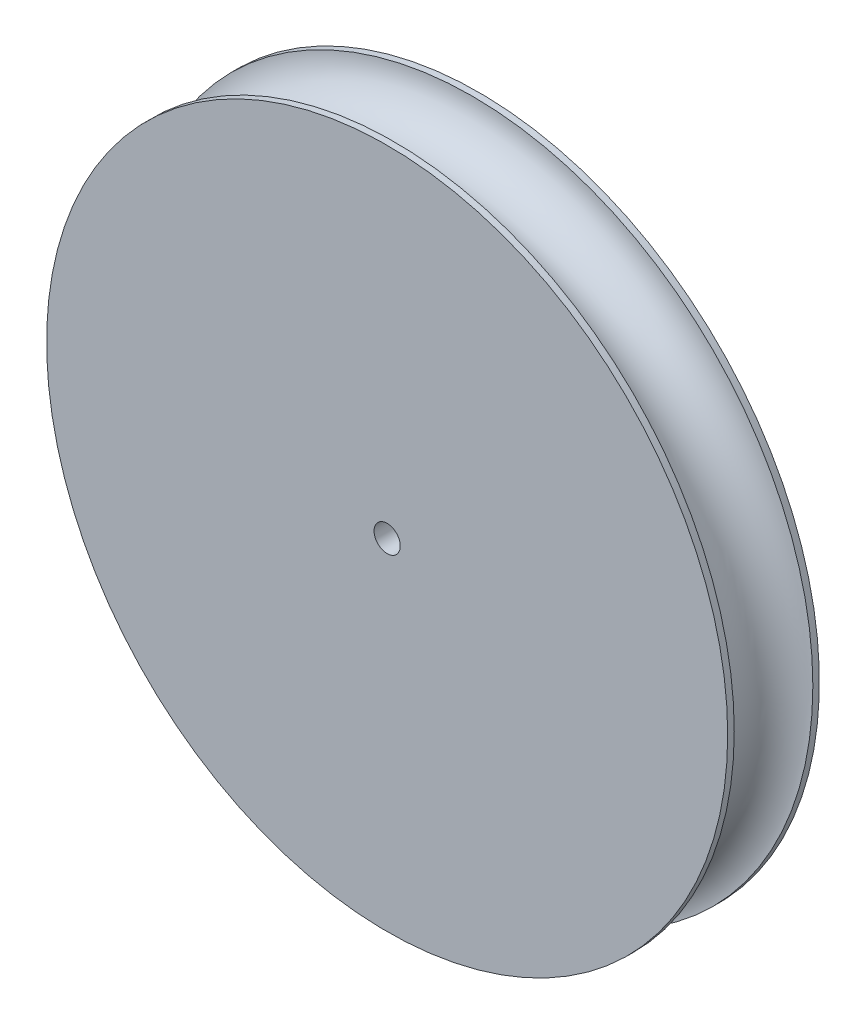
ISO-10303-21;
HEADER;
FILE_DESCRIPTION(('STEP AP214'),'2;1');
FILE_NAME('part.step','',(''),(''),'','','');
FILE_SCHEMA(('AUTOMOTIVE_DESIGN { 1 0 10303 214 1 1 1 1 }'));
ENDSEC;
DATA;
#1=APPLICATION_CONTEXT('core data for automotive mechanical design processes');
#2=APPLICATION_PROTOCOL_DEFINITION('international standard','automotive_design',2000,#1);
#3=PRODUCT_CONTEXT('',#1,'mechanical');
#4=PRODUCT('Part','Part','',(#3));
#5=PRODUCT_RELATED_PRODUCT_CATEGORY('part','',(#4));
#6=PRODUCT_DEFINITION_FORMATION('','',#4);
#7=PRODUCT_DEFINITION_CONTEXT('part definition',#1,'design');
#8=PRODUCT_DEFINITION('design','',#6,#7);
#9=PRODUCT_DEFINITION_SHAPE('','',#8);
#10=(LENGTH_UNIT() NAMED_UNIT(*) SI_UNIT(.MILLI.,.METRE.));
#11=(NAMED_UNIT(*) PLANE_ANGLE_UNIT() SI_UNIT($,.RADIAN.));
#12=(NAMED_UNIT(*) SI_UNIT($,.STERADIAN.) SOLID_ANGLE_UNIT());
#13=UNCERTAINTY_MEASURE_WITH_UNIT(LENGTH_MEASURE(1.E-05),#10,'distance_accuracy_value','');
#14=(GEOMETRIC_REPRESENTATION_CONTEXT(3) GLOBAL_UNCERTAINTY_ASSIGNED_CONTEXT((#13)) GLOBAL_UNIT_ASSIGNED_CONTEXT((#10,
#11,#12)) REPRESENTATION_CONTEXT('',''));
#15=CARTESIAN_POINT('',(0.,0.,0.));
#16=DIRECTION('',(0.,0.,1.));
#17=DIRECTION('',(1.,0.,0.));
#18=AXIS2_PLACEMENT_3D('',#15,#16,#17);
#19=CARTESIAN_POINT('',(0.,0.,-3.));
#20=DIRECTION('',(0.,0.,1.));
#21=DIRECTION('',(1.,0.,0.));
#22=AXIS2_PLACEMENT_3D('',#19,#20,#21);
#23=TOROIDAL_SURFACE('',#22,26.,3.);
#24=CARTESIAN_POINT('',(0.,0.,0.));
#25=DIRECTION('',(0.,0.,1.));
#26=DIRECTION('',(1.,0.,0.));
#27=AXIS2_PLACEMENT_3D('',#24,#25,#26);
#28=CIRCLE('',#27,26.);
#29=CARTESIAN_POINT('',(26.,0.,0.));
#30=VERTEX_POINT('',#29);
#31=EDGE_CURVE('E10',#30,#30,#28,.T.);
#32=ORIENTED_EDGE('',*,*,#31,.F.);
#33=EDGE_LOOP('',(#32));
#34=FACE_BOUND('',#33,.T.);
#35=CARTESIAN_POINT('',(0.,0.,-6.));
#36=DIRECTION('',(0.,0.,-1.));
#37=DIRECTION('',(-1.,0.,0.));
#38=AXIS2_PLACEMENT_3D('',#35,#36,#37);
#39=CIRCLE('',#38,26.);
#40=CARTESIAN_POINT('',(-26.,0.,-6.));
#41=VERTEX_POINT('',#40);
#42=EDGE_CURVE('E51',#41,#41,#39,.T.);
#43=ORIENTED_EDGE('',*,*,#42,.F.);
#44=EDGE_LOOP('',(#43));
#45=FACE_BOUND('',#44,.T.);
#46=ADVANCED_FACE('F34',(#34,#45),#23,.F.);
#47=CARTESIAN_POINT('',(0.,0.,0.5));
#48=DIRECTION('',(0.,0.,1.));
#49=DIRECTION('',(1.,0.,0.));
#50=AXIS2_PLACEMENT_3D('',#47,#48,#49);
#51=PLANE('',#50);
#52=CARTESIAN_POINT('',(0.,0.,0.5));
#53=DIRECTION('',(0.,0.,1.));
#54=DIRECTION('',(1.,0.,0.));
#55=AXIS2_PLACEMENT_3D('',#52,#53,#54);
#56=CIRCLE('',#55,26.);
#57=CARTESIAN_POINT('',(26.,0.,0.5));
#58=VERTEX_POINT('',#57);
#59=EDGE_CURVE('E40',#58,#58,#56,.T.);
#60=ORIENTED_EDGE('',*,*,#59,.T.);
#61=EDGE_LOOP('',(#60));
#62=FACE_BOUND('',#61,.T.);
#63=CARTESIAN_POINT('',(0.,0.,0.5));
#64=DIRECTION('',(0.,0.,1.));
#65=DIRECTION('',(1.,0.,0.));
#66=AXIS2_PLACEMENT_3D('',#63,#64,#65);
#67=CIRCLE('',#66,1.);
#68=CARTESIAN_POINT('',(1.,0.,0.5));
#69=VERTEX_POINT('',#68);
#70=EDGE_CURVE('E44',#69,#69,#67,.T.);
#71=ORIENTED_EDGE('',*,*,#70,.F.);
#72=EDGE_LOOP('',(#71));
#73=FACE_BOUND('',#72,.T.);
#74=ADVANCED_FACE('F75',(#62,#73),#51,.T.);
#75=CARTESIAN_POINT('',(0.,0.,0.5));
#76=DIRECTION('',(0.,0.,-1.));
#77=DIRECTION('',(-1.,0.,0.));
#78=AXIS2_PLACEMENT_3D('',#75,#76,#77);
#79=CYLINDRICAL_SURFACE('',#78,26.);
#80=ORIENTED_EDGE('',*,*,#59,.F.);
#81=EDGE_LOOP('',(#80));
#82=FACE_BOUND('',#81,.T.);
#83=ORIENTED_EDGE('',*,*,#31,.T.);
#84=EDGE_LOOP('',(#83));
#85=FACE_BOUND('',#84,.T.);
#86=ADVANCED_FACE('F80',(#82,#85),#79,.T.);
#87=CARTESIAN_POINT('',(0.,0.,0.5));
#88=DIRECTION('',(0.,0.,-1.));
#89=DIRECTION('',(-1.,0.,0.));
#90=AXIS2_PLACEMENT_3D('',#87,#88,#89);
#91=CYLINDRICAL_SURFACE('',#90,1.);
#92=ORIENTED_EDGE('',*,*,#70,.T.);
#93=EDGE_LOOP('',(#92));
#94=FACE_BOUND('',#93,.T.);
#95=CARTESIAN_POINT('',(0.,0.,-6.5));
#96=DIRECTION('',(0.,0.,-1.));
#97=DIRECTION('',(-1.,0.,0.));
#98=AXIS2_PLACEMENT_3D('',#95,#96,#97);
#99=CIRCLE('',#98,1.);
#100=CARTESIAN_POINT('',(-1.,0.,-6.5));
#101=VERTEX_POINT('',#100);
#102=EDGE_CURVE('E54',#101,#101,#99,.T.);
#103=ORIENTED_EDGE('',*,*,#102,.T.);
#104=EDGE_LOOP('',(#103));
#105=FACE_BOUND('',#104,.T.);
#106=ADVANCED_FACE('F60',(#94,#105),#91,.F.);
#107=CARTESIAN_POINT('',(0.,0.,-6.5));
#108=DIRECTION('',(0.,0.,1.));
#109=DIRECTION('',(1.,0.,0.));
#110=AXIS2_PLACEMENT_3D('',#107,#108,#109);
#111=CYLINDRICAL_SURFACE('',#110,26.);
#112=CARTESIAN_POINT('',(0.,0.,-6.5));
#113=DIRECTION('',(0.,0.,-1.));
#114=DIRECTION('',(-1.,0.,0.));
#115=AXIS2_PLACEMENT_3D('',#112,#113,#114);
#116=CIRCLE('',#115,26.);
#117=CARTESIAN_POINT('',(-26.,0.,-6.5));
#118=VERTEX_POINT('',#117);
#119=EDGE_CURVE('E48',#118,#118,#116,.T.);
#120=ORIENTED_EDGE('',*,*,#119,.F.);
#121=EDGE_LOOP('',(#120));
#122=FACE_BOUND('',#121,.T.);
#123=ORIENTED_EDGE('',*,*,#42,.T.);
#124=EDGE_LOOP('',(#123));
#125=FACE_BOUND('',#124,.T.);
#126=ADVANCED_FACE('F65',(#122,#125),#111,.T.);
#127=CARTESIAN_POINT('',(0.,0.,-6.5));
#128=DIRECTION('',(0.,0.,-1.));
#129=DIRECTION('',(-1.,0.,0.));
#130=AXIS2_PLACEMENT_3D('',#127,#128,#129);
#131=PLANE('',#130);
#132=ORIENTED_EDGE('',*,*,#102,.F.);
#133=EDGE_LOOP('',(#132));
#134=FACE_BOUND('',#133,.T.);
#135=ORIENTED_EDGE('',*,*,#119,.T.);
#136=EDGE_LOOP('',(#135));
#137=FACE_BOUND('',#136,.T.);
#138=ADVANCED_FACE('F62',(#134,#137),#131,.T.);
#139=CLOSED_SHELL('',(#46,#74,#86,#106,#126,#138));
#140=MANIFOLD_SOLID_BREP('B2',#139);
#141=ADVANCED_BREP_SHAPE_REPRESENTATION('',(#18,#140),#14);
#142=SHAPE_DEFINITION_REPRESENTATION(#9,#141);
ENDSEC;
END-ISO-10303-21;
